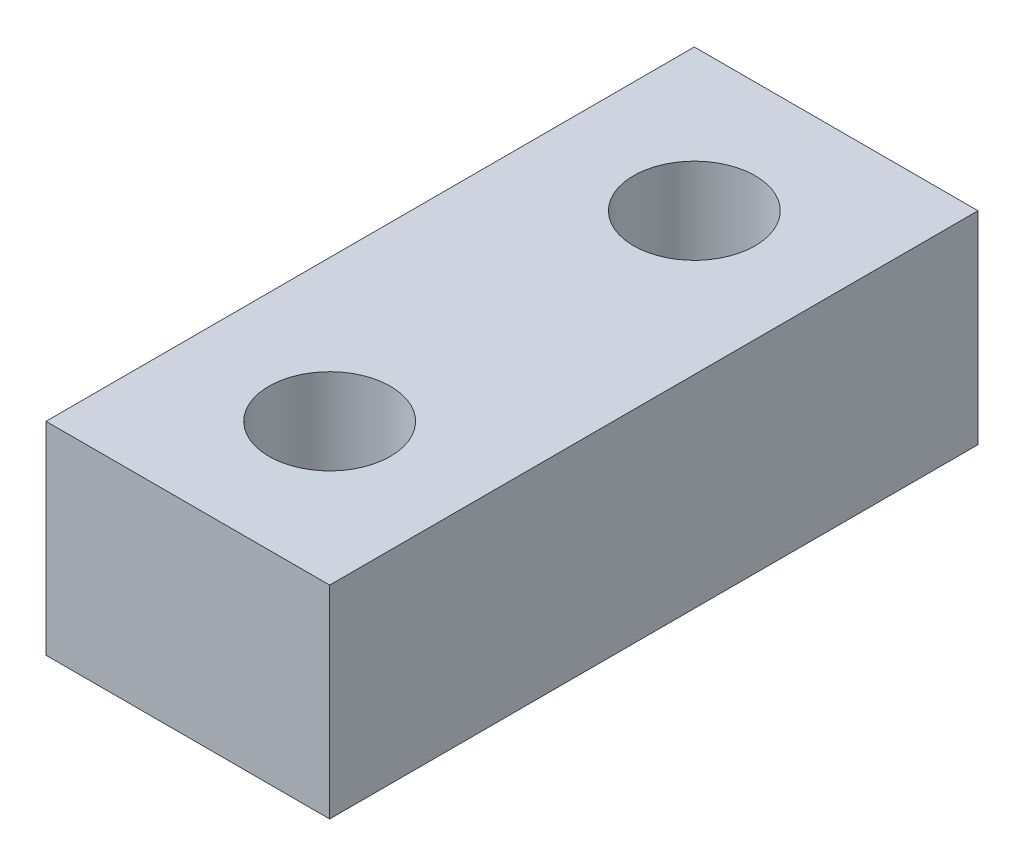
ISO-10303-21;
HEADER;
FILE_DESCRIPTION(('STEP AP214'),'2;1');
FILE_NAME('part.step','',(''),(''),'','','');
FILE_SCHEMA(('AUTOMOTIVE_DESIGN { 1 0 10303 214 1 1 1 1 }'));
ENDSEC;
DATA;
#1=APPLICATION_CONTEXT('core data for automotive mechanical design processes');
#2=APPLICATION_PROTOCOL_DEFINITION('international standard','automotive_design',2000,#1);
#3=PRODUCT_CONTEXT('',#1,'mechanical');
#4=PRODUCT('Part','Part','',(#3));
#5=PRODUCT_RELATED_PRODUCT_CATEGORY('part','',(#4));
#6=PRODUCT_DEFINITION_FORMATION('','',#4);
#7=PRODUCT_DEFINITION_CONTEXT('part definition',#1,'design');
#8=PRODUCT_DEFINITION('design','',#6,#7);
#9=PRODUCT_DEFINITION_SHAPE('','',#8);
#10=(LENGTH_UNIT() NAMED_UNIT(*) SI_UNIT(.MILLI.,.METRE.));
#11=(NAMED_UNIT(*) PLANE_ANGLE_UNIT() SI_UNIT($,.RADIAN.));
#12=(NAMED_UNIT(*) SI_UNIT($,.STERADIAN.) SOLID_ANGLE_UNIT());
#13=UNCERTAINTY_MEASURE_WITH_UNIT(LENGTH_MEASURE(1.E-05),#10,'distance_accuracy_value','');
#14=(GEOMETRIC_REPRESENTATION_CONTEXT(3) GLOBAL_UNCERTAINTY_ASSIGNED_CONTEXT((#13)) GLOBAL_UNIT_ASSIGNED_CONTEXT((#10,
#11,#12)) REPRESENTATION_CONTEXT('',''));
#15=CARTESIAN_POINT('',(0.,0.,0.));
#16=DIRECTION('',(0.,0.,1.));
#17=DIRECTION('',(1.,0.,0.));
#18=AXIS2_PLACEMENT_3D('',#15,#16,#17);
#19=CARTESIAN_POINT('',(0.,5.,16.));
#20=DIRECTION('',(-1.,0.,0.));
#21=DIRECTION('',(0.,-1.,0.));
#22=AXIS2_PLACEMENT_3D('',#19,#20,#21);
#23=PLANE('',#22);
#24=DIRECTION('',(0.,1.,0.));
#25=VECTOR('',#24,1.);
#26=CARTESIAN_POINT('',(0.,5.,0.));
#27=LINE('',#26,#25);
#28=CARTESIAN_POINT('',(0.,0.,0.));
#29=VERTEX_POINT('',#28);
#30=CARTESIAN_POINT('',(0.,5.,0.));
#31=VERTEX_POINT('',#30);
#32=EDGE_CURVE('E97',#29,#31,#27,.T.);
#33=ORIENTED_EDGE('',*,*,#32,.T.);
#34=DIRECTION('',(0.,0.,-1.));
#35=VECTOR('',#34,1.);
#36=CARTESIAN_POINT('',(0.,5.,16.));
#37=LINE('',#36,#35);
#38=CARTESIAN_POINT('',(0.,5.,16.));
#39=VERTEX_POINT('',#38);
#40=EDGE_CURVE('E11',#39,#31,#37,.T.);
#41=ORIENTED_EDGE('',*,*,#40,.F.);
#42=DIRECTION('',(0.,1.,0.));
#43=VECTOR('',#42,1.);
#44=CARTESIAN_POINT('',(0.,5.,16.));
#45=LINE('',#44,#43);
#46=CARTESIAN_POINT('',(0.,0.,16.));
#47=VERTEX_POINT('',#46);
#48=EDGE_CURVE('E85',#47,#39,#45,.T.);
#49=ORIENTED_EDGE('',*,*,#48,.F.);
#50=DIRECTION('',(0.,0.,-1.));
#51=VECTOR('',#50,1.);
#52=CARTESIAN_POINT('',(0.,0.,16.));
#53=LINE('',#52,#51);
#54=EDGE_CURVE('E93',#47,#29,#53,.T.);
#55=ORIENTED_EDGE('',*,*,#54,.T.);
#56=EDGE_LOOP('',(#33,#41,#49,#55));
#57=FACE_BOUND('',#56,.T.);
#58=ADVANCED_FACE('F34',(#57),#23,.F.);
#59=CARTESIAN_POINT('',(-7.,5.,16.));
#60=DIRECTION('',(0.,-1.,0.));
#61=DIRECTION('',(1.,0.,0.));
#62=AXIS2_PLACEMENT_3D('',#59,#60,#61);
#63=PLANE('',#62);
#64=CARTESIAN_POINT('',(-3.5,5.,3.5));
#65=DIRECTION('',(0.,-1.,0.));
#66=DIRECTION('',(1.,0.,0.));
#67=AXIS2_PLACEMENT_3D('',#64,#65,#66);
#68=CIRCLE('',#67,1.5);
#69=CARTESIAN_POINT('',(-2.,5.,3.5));
#70=VERTEX_POINT('',#69);
#71=EDGE_CURVE('E114',#70,#70,#68,.T.);
#72=ORIENTED_EDGE('',*,*,#71,.T.);
#73=EDGE_LOOP('',(#72));
#74=FACE_BOUND('',#73,.T.);
#75=CARTESIAN_POINT('',(-3.5,5.,12.5));
#76=DIRECTION('',(0.,-1.,0.));
#77=DIRECTION('',(1.,0.,0.));
#78=AXIS2_PLACEMENT_3D('',#75,#76,#77);
#79=CIRCLE('',#78,1.5);
#80=CARTESIAN_POINT('',(-2.,5.,12.5));
#81=VERTEX_POINT('',#80);
#82=EDGE_CURVE('E100',#81,#81,#79,.T.);
#83=ORIENTED_EDGE('',*,*,#82,.T.);
#84=EDGE_LOOP('',(#83));
#85=FACE_BOUND('',#84,.T.);
#86=DIRECTION('',(-1.,0.,0.));
#87=VECTOR('',#86,1.);
#88=CARTESIAN_POINT('',(-7.,5.,0.));
#89=LINE('',#88,#87);
#90=CARTESIAN_POINT('',(-7.,5.,0.));
#91=VERTEX_POINT('',#90);
#92=EDGE_CURVE('E89',#31,#91,#89,.T.);
#93=ORIENTED_EDGE('',*,*,#92,.T.);
#94=DIRECTION('',(0.,0.,-1.));
#95=VECTOR('',#94,1.);
#96=CARTESIAN_POINT('',(-7.,5.,16.));
#97=LINE('',#96,#95);
#98=CARTESIAN_POINT('',(-7.,5.,16.));
#99=VERTEX_POINT('',#98);
#100=EDGE_CURVE('E42',#99,#91,#97,.T.);
#101=ORIENTED_EDGE('',*,*,#100,.F.);
#102=DIRECTION('',(-1.,0.,0.));
#103=VECTOR('',#102,1.);
#104=CARTESIAN_POINT('',(-7.,5.,16.));
#105=LINE('',#104,#103);
#106=EDGE_CURVE('E80',#39,#99,#105,.T.);
#107=ORIENTED_EDGE('',*,*,#106,.F.);
#108=ORIENTED_EDGE('',*,*,#40,.T.);
#109=EDGE_LOOP('',(#93,#101,#107,#108));
#110=FACE_BOUND('',#109,.T.);
#111=ADVANCED_FACE('F88',(#74,#85,#110),#63,.F.);
#112=CARTESIAN_POINT('',(-7.,0.,16.));
#113=DIRECTION('',(1.,0.,0.));
#114=DIRECTION('',(0.,0.,-1.));
#115=AXIS2_PLACEMENT_3D('',#112,#113,#114);
#116=PLANE('',#115);
#117=DIRECTION('',(0.,-1.,0.));
#118=VECTOR('',#117,1.);
#119=CARTESIAN_POINT('',(-7.,0.,0.));
#120=LINE('',#119,#118);
#121=CARTESIAN_POINT('',(-7.,0.,0.));
#122=VERTEX_POINT('',#121);
#123=EDGE_CURVE('E67',#91,#122,#120,.T.);
#124=ORIENTED_EDGE('',*,*,#123,.T.);
#125=DIRECTION('',(0.,0.,-1.));
#126=VECTOR('',#125,1.);
#127=CARTESIAN_POINT('',(-7.,0.,16.));
#128=LINE('',#127,#126);
#129=CARTESIAN_POINT('',(-7.,0.,16.));
#130=VERTEX_POINT('',#129);
#131=EDGE_CURVE('E90',#130,#122,#128,.T.);
#132=ORIENTED_EDGE('',*,*,#131,.F.);
#133=DIRECTION('',(0.,-1.,0.));
#134=VECTOR('',#133,1.);
#135=CARTESIAN_POINT('',(-7.,0.,16.));
#136=LINE('',#135,#134);
#137=EDGE_CURVE('E83',#99,#130,#136,.T.);
#138=ORIENTED_EDGE('',*,*,#137,.F.);
#139=ORIENTED_EDGE('',*,*,#100,.T.);
#140=EDGE_LOOP('',(#124,#132,#138,#139));
#141=FACE_BOUND('',#140,.T.);
#142=ADVANCED_FACE('F91',(#141),#116,.F.);
#143=CARTESIAN_POINT('',(0.,0.,16.));
#144=DIRECTION('',(0.,1.,0.));
#145=DIRECTION('',(-1.,0.,0.));
#146=AXIS2_PLACEMENT_3D('',#143,#144,#145);
#147=PLANE('',#146);
#148=CARTESIAN_POINT('',(-3.5,0.,3.5));
#149=DIRECTION('',(0.,-1.,0.));
#150=DIRECTION('',(1.,0.,0.));
#151=AXIS2_PLACEMENT_3D('',#148,#149,#150);
#152=CIRCLE('',#151,1.5);
#153=CARTESIAN_POINT('',(-2.,0.,3.5));
#154=VERTEX_POINT('',#153);
#155=EDGE_CURVE('E117',#154,#154,#152,.T.);
#156=ORIENTED_EDGE('',*,*,#155,.F.);
#157=EDGE_LOOP('',(#156));
#158=FACE_BOUND('',#157,.T.);
#159=CARTESIAN_POINT('',(-3.5,0.,12.5));
#160=DIRECTION('',(0.,-1.,0.));
#161=DIRECTION('',(1.,0.,0.));
#162=AXIS2_PLACEMENT_3D('',#159,#160,#161);
#163=CIRCLE('',#162,1.5);
#164=CARTESIAN_POINT('',(-2.,0.,12.5));
#165=VERTEX_POINT('',#164);
#166=EDGE_CURVE('E111',#165,#165,#163,.T.);
#167=ORIENTED_EDGE('',*,*,#166,.F.);
#168=EDGE_LOOP('',(#167));
#169=FACE_BOUND('',#168,.T.);
#170=DIRECTION('',(1.,0.,0.));
#171=VECTOR('',#170,1.);
#172=CARTESIAN_POINT('',(0.,0.,0.));
#173=LINE('',#172,#171);
#174=EDGE_CURVE('E73',#122,#29,#173,.T.);
#175=ORIENTED_EDGE('',*,*,#174,.T.);
#176=ORIENTED_EDGE('',*,*,#54,.F.);
#177=DIRECTION('',(1.,0.,0.));
#178=VECTOR('',#177,1.);
#179=CARTESIAN_POINT('',(0.,0.,16.));
#180=LINE('',#179,#178);
#181=EDGE_CURVE('E50',#130,#47,#180,.T.);
#182=ORIENTED_EDGE('',*,*,#181,.F.);
#183=ORIENTED_EDGE('',*,*,#131,.T.);
#184=EDGE_LOOP('',(#175,#176,#182,#183));
#185=FACE_BOUND('',#184,.T.);
#186=ADVANCED_FACE('F105',(#158,#169,#185),#147,.F.);
#187=CARTESIAN_POINT('',(0.,0.,16.));
#188=DIRECTION('',(0.,0.,-1.));
#189=DIRECTION('',(-1.,0.,0.));
#190=AXIS2_PLACEMENT_3D('',#187,#188,#189);
#191=PLANE('',#190);
#192=ORIENTED_EDGE('',*,*,#48,.T.);
#193=ORIENTED_EDGE('',*,*,#106,.T.);
#194=ORIENTED_EDGE('',*,*,#137,.T.);
#195=ORIENTED_EDGE('',*,*,#181,.T.);
#196=EDGE_LOOP('',(#192,#193,#194,#195));
#197=FACE_BOUND('',#196,.T.);
#198=ADVANCED_FACE('F81',(#197),#191,.F.);
#199=CARTESIAN_POINT('',(0.,0.,0.));
#200=DIRECTION('',(0.,0.,-1.));
#201=DIRECTION('',(-1.,0.,0.));
#202=AXIS2_PLACEMENT_3D('',#199,#200,#201);
#203=PLANE('',#202);
#204=ORIENTED_EDGE('',*,*,#32,.F.);
#205=ORIENTED_EDGE('',*,*,#174,.F.);
#206=ORIENTED_EDGE('',*,*,#123,.F.);
#207=ORIENTED_EDGE('',*,*,#92,.F.);
#208=EDGE_LOOP('',(#204,#205,#206,#207));
#209=FACE_BOUND('',#208,.T.);
#210=ADVANCED_FACE('F108',(#209),#203,.T.);
#211=CARTESIAN_POINT('',(-3.5,5.,12.5));
#212=DIRECTION('',(0.,-1.,0.));
#213=DIRECTION('',(1.,0.,0.));
#214=AXIS2_PLACEMENT_3D('',#211,#212,#213);
#215=CYLINDRICAL_SURFACE('',#214,1.5);
#216=CARTESIAN_POINT('',(-2.,5.,12.5));
#217=CARTESIAN_POINT('',(-2.,4.94791666666667,12.5));
#218=CARTESIAN_POINT('',(-2.,4.89583333333334,12.5));
#219=CARTESIAN_POINT('',(-2.,4.79166666666667,12.5));
#220=CARTESIAN_POINT('',(-2.,4.73958333333334,12.5));
#221=CARTESIAN_POINT('',(-2.,4.63541666666667,12.5));
#222=CARTESIAN_POINT('',(-2.,4.58333333333334,12.5));
#223=CARTESIAN_POINT('',(-2.,4.47916666666667,12.5));
#224=CARTESIAN_POINT('',(-2.,4.42708333333334,12.5));
#225=CARTESIAN_POINT('',(-2.,4.32291666666667,12.5));
#226=CARTESIAN_POINT('',(-2.,4.27083333333334,12.5));
#227=CARTESIAN_POINT('',(-2.,4.16666666666667,12.5));
#228=CARTESIAN_POINT('',(-2.,4.11458333333334,12.5));
#229=CARTESIAN_POINT('',(-2.,4.01041666666667,12.5));
#230=CARTESIAN_POINT('',(-2.,3.95833333333334,12.5));
#231=CARTESIAN_POINT('',(-2.,3.85416666666667,12.5));
#232=CARTESIAN_POINT('',(-2.,3.80208333333333,12.5));
#233=CARTESIAN_POINT('',(-2.,3.69791666666667,12.5));
#234=CARTESIAN_POINT('',(-2.,3.64583333333333,12.5));
#235=CARTESIAN_POINT('',(-2.,3.54166666666667,12.5));
#236=CARTESIAN_POINT('',(-2.,3.48958333333333,12.5));
#237=CARTESIAN_POINT('',(-2.,3.38541666666667,12.5));
#238=CARTESIAN_POINT('',(-2.,3.33333333333333,12.5));
#239=CARTESIAN_POINT('',(-2.,3.22916666666667,12.5));
#240=CARTESIAN_POINT('',(-2.,3.17708333333333,12.5));
#241=CARTESIAN_POINT('',(-2.,3.07291666666667,12.5));
#242=CARTESIAN_POINT('',(-2.,3.02083333333333,12.5));
#243=CARTESIAN_POINT('',(-2.,2.91666666666667,12.5));
#244=CARTESIAN_POINT('',(-2.,2.86458333333333,12.5));
#245=CARTESIAN_POINT('',(-2.,2.76041666666667,12.5));
#246=CARTESIAN_POINT('',(-2.,2.70833333333333,12.5));
#247=CARTESIAN_POINT('',(-2.,2.60416666666667,12.5));
#248=CARTESIAN_POINT('',(-2.,2.55208333333333,12.5));
#249=CARTESIAN_POINT('',(-2.,2.44791666666667,12.5));
#250=CARTESIAN_POINT('',(-2.,2.39583333333333,12.5));
#251=CARTESIAN_POINT('',(-2.,2.29166666666667,12.5));
#252=CARTESIAN_POINT('',(-2.,2.23958333333333,12.5));
#253=CARTESIAN_POINT('',(-2.,2.13541666666667,12.5));
#254=CARTESIAN_POINT('',(-2.,2.08333333333333,12.5));
#255=CARTESIAN_POINT('',(-2.,1.97916666666667,12.5));
#256=CARTESIAN_POINT('',(-2.,1.92708333333333,12.5));
#257=CARTESIAN_POINT('',(-2.,1.82291666666667,12.5));
#258=CARTESIAN_POINT('',(-2.,1.77083333333333,12.5));
#259=CARTESIAN_POINT('',(-2.,1.66666666666667,12.5));
#260=CARTESIAN_POINT('',(-2.,1.61458333333333,12.5));
#261=CARTESIAN_POINT('',(-2.,1.51041666666667,12.5));
#262=CARTESIAN_POINT('',(-2.,1.45833333333333,12.5));
#263=CARTESIAN_POINT('',(-2.,1.35416666666667,12.5));
#264=CARTESIAN_POINT('',(-2.,1.30208333333333,12.5));
#265=CARTESIAN_POINT('',(-2.,1.19791666666667,12.5));
#266=CARTESIAN_POINT('',(-2.,1.14583333333333,12.5));
#267=CARTESIAN_POINT('',(-2.,1.04166666666667,12.5));
#268=CARTESIAN_POINT('',(-2.,0.989583333333334,12.5));
#269=CARTESIAN_POINT('',(-2.,0.885416666666668,12.5));
#270=CARTESIAN_POINT('',(-2.,0.833333333333334,12.5));
#271=CARTESIAN_POINT('',(-2.,0.729166666666667,12.5));
#272=CARTESIAN_POINT('',(-2.,0.677083333333334,12.5));
#273=CARTESIAN_POINT('',(-2.,0.572916666666667,12.5));
#274=CARTESIAN_POINT('',(-2.,0.520833333333334,12.5));
#275=CARTESIAN_POINT('',(-2.,0.416666666666667,12.5));
#276=CARTESIAN_POINT('',(-2.,0.364583333333334,12.5));
#277=CARTESIAN_POINT('',(-2.,0.260416666666667,12.5));
#278=CARTESIAN_POINT('',(-2.,0.208333333333333,12.5));
#279=CARTESIAN_POINT('',(-2.,0.104166666666667,12.5));
#280=CARTESIAN_POINT('',(-2.,0.0520833333333334,12.5));
#281=CARTESIAN_POINT('',(-2.,0.,12.5));
#282=B_SPLINE_CURVE_WITH_KNOTS('',3,(#216,#217,#218,#219,#220,#221,#222,#223,#224,#225,#226,
#227,#228,#229,#230,#231,#232,#233,#234,#235,#236,#237,#238,#239,#240,#241,#242,#243,#244,#245,
#246,#247,#248,#249,#250,#251,#252,#253,#254,#255,#256,#257,#258,#259,#260,#261,#262,#263,#264,
#265,#266,#267,#268,#269,#270,#271,#272,#273,#274,#275,#276,#277,#278,#279,#280,#281),
.UNSPECIFIED.,.F.,.F.,(4,2,2,2,2,2,2,2,2,2,2,2,2,2,2,2,2,2,2,2,2,2,2,2,2,2,2,2,2,2,2,2,4),(0.,
0.15625,0.3125,0.46875,0.625000000000001,0.781250000000001,0.937500000000001,1.09375,1.25,
1.40625,1.5625,1.71875,1.875,2.03125,2.1875,2.34375,2.5,2.65625,2.8125,2.96875,3.125,3.28125,
3.4375,3.59375,3.75,3.90625,4.0625,4.21875,4.375,4.53125,4.6875,4.84375,5.),.UNSPECIFIED.);
#283=EDGE_CURVE('BSEAM128',#81,#165,#282,.T.);
#284=ORIENTED_EDGE('',*,*,#82,.F.);
#285=ORIENTED_EDGE('',*,*,#166,.T.);
#286=ORIENTED_EDGE('',*,*,#283,.T.);
#287=ORIENTED_EDGE('',*,*,#283,.F.);
#288=EDGE_LOOP('',(#284,#286,#285,#287));
#289=FACE_BOUND('',#288,.T.);
#290=ADVANCED_FACE('F128',(#289),#215,.F.);
#291=CARTESIAN_POINT('',(-3.5,5.,3.5));
#292=DIRECTION('',(0.,-1.,0.));
#293=DIRECTION('',(1.,0.,0.));
#294=AXIS2_PLACEMENT_3D('',#291,#292,#293);
#295=CYLINDRICAL_SURFACE('',#294,1.5);
#296=CARTESIAN_POINT('',(-2.,5.,3.5));
#297=CARTESIAN_POINT('',(-2.,4.94791666666667,3.5));
#298=CARTESIAN_POINT('',(-2.,4.89583333333334,3.5));
#299=CARTESIAN_POINT('',(-2.,4.79166666666667,3.5));
#300=CARTESIAN_POINT('',(-2.,4.73958333333334,3.5));
#301=CARTESIAN_POINT('',(-2.,4.63541666666667,3.5));
#302=CARTESIAN_POINT('',(-2.,4.58333333333334,3.5));
#303=CARTESIAN_POINT('',(-2.,4.47916666666667,3.5));
#304=CARTESIAN_POINT('',(-2.,4.42708333333334,3.5));
#305=CARTESIAN_POINT('',(-2.,4.32291666666667,3.5));
#306=CARTESIAN_POINT('',(-2.,4.27083333333334,3.5));
#307=CARTESIAN_POINT('',(-2.,4.16666666666667,3.5));
#308=CARTESIAN_POINT('',(-2.,4.11458333333334,3.5));
#309=CARTESIAN_POINT('',(-2.,4.01041666666667,3.5));
#310=CARTESIAN_POINT('',(-2.,3.95833333333334,3.5));
#311=CARTESIAN_POINT('',(-2.,3.85416666666667,3.5));
#312=CARTESIAN_POINT('',(-2.,3.80208333333333,3.5));
#313=CARTESIAN_POINT('',(-2.,3.69791666666667,3.5));
#314=CARTESIAN_POINT('',(-2.,3.64583333333333,3.5));
#315=CARTESIAN_POINT('',(-2.,3.54166666666667,3.5));
#316=CARTESIAN_POINT('',(-2.,3.48958333333333,3.5));
#317=CARTESIAN_POINT('',(-2.,3.38541666666667,3.5));
#318=CARTESIAN_POINT('',(-2.,3.33333333333333,3.5));
#319=CARTESIAN_POINT('',(-2.,3.22916666666667,3.5));
#320=CARTESIAN_POINT('',(-2.,3.17708333333333,3.5));
#321=CARTESIAN_POINT('',(-2.,3.07291666666667,3.5));
#322=CARTESIAN_POINT('',(-2.,3.02083333333333,3.5));
#323=CARTESIAN_POINT('',(-2.,2.91666666666667,3.5));
#324=CARTESIAN_POINT('',(-2.,2.86458333333333,3.5));
#325=CARTESIAN_POINT('',(-2.,2.76041666666667,3.5));
#326=CARTESIAN_POINT('',(-2.,2.70833333333333,3.5));
#327=CARTESIAN_POINT('',(-2.,2.60416666666667,3.5));
#328=CARTESIAN_POINT('',(-2.,2.55208333333333,3.5));
#329=CARTESIAN_POINT('',(-2.,2.44791666666667,3.5));
#330=CARTESIAN_POINT('',(-2.,2.39583333333333,3.5));
#331=CARTESIAN_POINT('',(-2.,2.29166666666667,3.5));
#332=CARTESIAN_POINT('',(-2.,2.23958333333333,3.5));
#333=CARTESIAN_POINT('',(-2.,2.13541666666667,3.5));
#334=CARTESIAN_POINT('',(-2.,2.08333333333333,3.5));
#335=CARTESIAN_POINT('',(-2.,1.97916666666667,3.5));
#336=CARTESIAN_POINT('',(-2.,1.92708333333333,3.5));
#337=CARTESIAN_POINT('',(-2.,1.82291666666667,3.5));
#338=CARTESIAN_POINT('',(-2.,1.77083333333333,3.5));
#339=CARTESIAN_POINT('',(-2.,1.66666666666667,3.5));
#340=CARTESIAN_POINT('',(-2.,1.61458333333333,3.5));
#341=CARTESIAN_POINT('',(-2.,1.51041666666667,3.5));
#342=CARTESIAN_POINT('',(-2.,1.45833333333333,3.5));
#343=CARTESIAN_POINT('',(-2.,1.35416666666667,3.5));
#344=CARTESIAN_POINT('',(-2.,1.30208333333333,3.5));
#345=CARTESIAN_POINT('',(-2.,1.19791666666667,3.5));
#346=CARTESIAN_POINT('',(-2.,1.14583333333333,3.5));
#347=CARTESIAN_POINT('',(-2.,1.04166666666667,3.5));
#348=CARTESIAN_POINT('',(-2.,0.989583333333334,3.5));
#349=CARTESIAN_POINT('',(-2.,0.885416666666668,3.5));
#350=CARTESIAN_POINT('',(-2.,0.833333333333334,3.5));
#351=CARTESIAN_POINT('',(-2.,0.729166666666667,3.5));
#352=CARTESIAN_POINT('',(-2.,0.677083333333334,3.5));
#353=CARTESIAN_POINT('',(-2.,0.572916666666667,3.5));
#354=CARTESIAN_POINT('',(-2.,0.520833333333334,3.5));
#355=CARTESIAN_POINT('',(-2.,0.416666666666667,3.5));
#356=CARTESIAN_POINT('',(-2.,0.364583333333334,3.5));
#357=CARTESIAN_POINT('',(-2.,0.260416666666667,3.5));
#358=CARTESIAN_POINT('',(-2.,0.208333333333333,3.5));
#359=CARTESIAN_POINT('',(-2.,0.104166666666667,3.5));
#360=CARTESIAN_POINT('',(-2.,0.0520833333333334,3.5));
#361=CARTESIAN_POINT('',(-2.,0.,3.5));
#362=B_SPLINE_CURVE_WITH_KNOTS('',3,(#296,#297,#298,#299,#300,#301,#302,#303,#304,#305,#306,
#307,#308,#309,#310,#311,#312,#313,#314,#315,#316,#317,#318,#319,#320,#321,#322,#323,#324,#325,
#326,#327,#328,#329,#330,#331,#332,#333,#334,#335,#336,#337,#338,#339,#340,#341,#342,#343,#344,
#345,#346,#347,#348,#349,#350,#351,#352,#353,#354,#355,#356,#357,#358,#359,#360,#361),
.UNSPECIFIED.,.F.,.F.,(4,2,2,2,2,2,2,2,2,2,2,2,2,2,2,2,2,2,2,2,2,2,2,2,2,2,2,2,2,2,2,2,4),(0.,
0.15625,0.3125,0.46875,0.625000000000001,0.781250000000001,0.937500000000001,1.09375,1.25,
1.40625,1.5625,1.71875,1.875,2.03125,2.1875,2.34375,2.5,2.65625,2.8125,2.96875,3.125,3.28125,
3.4375,3.59375,3.75,3.90625,4.0625,4.21875,4.375,4.53125,4.6875,4.84375,5.),.UNSPECIFIED.);
#363=EDGE_CURVE('BSEAM125',#70,#154,#362,.T.);
#364=ORIENTED_EDGE('',*,*,#71,.F.);
#365=ORIENTED_EDGE('',*,*,#155,.T.);
#366=ORIENTED_EDGE('',*,*,#363,.T.);
#367=ORIENTED_EDGE('',*,*,#363,.F.);
#368=EDGE_LOOP('',(#364,#366,#365,#367));
#369=FACE_BOUND('',#368,.T.);
#370=ADVANCED_FACE('F125',(#369),#295,.F.);
#371=CLOSED_SHELL('',(#58,#111,#142,#186,#198,#210,#290,#370));
#372=MANIFOLD_SOLID_BREP('B2',#371);
#373=ADVANCED_BREP_SHAPE_REPRESENTATION('',(#18,#372),#14);
#374=SHAPE_DEFINITION_REPRESENTATION(#9,#373);
ENDSEC;
END-ISO-10303-21;
